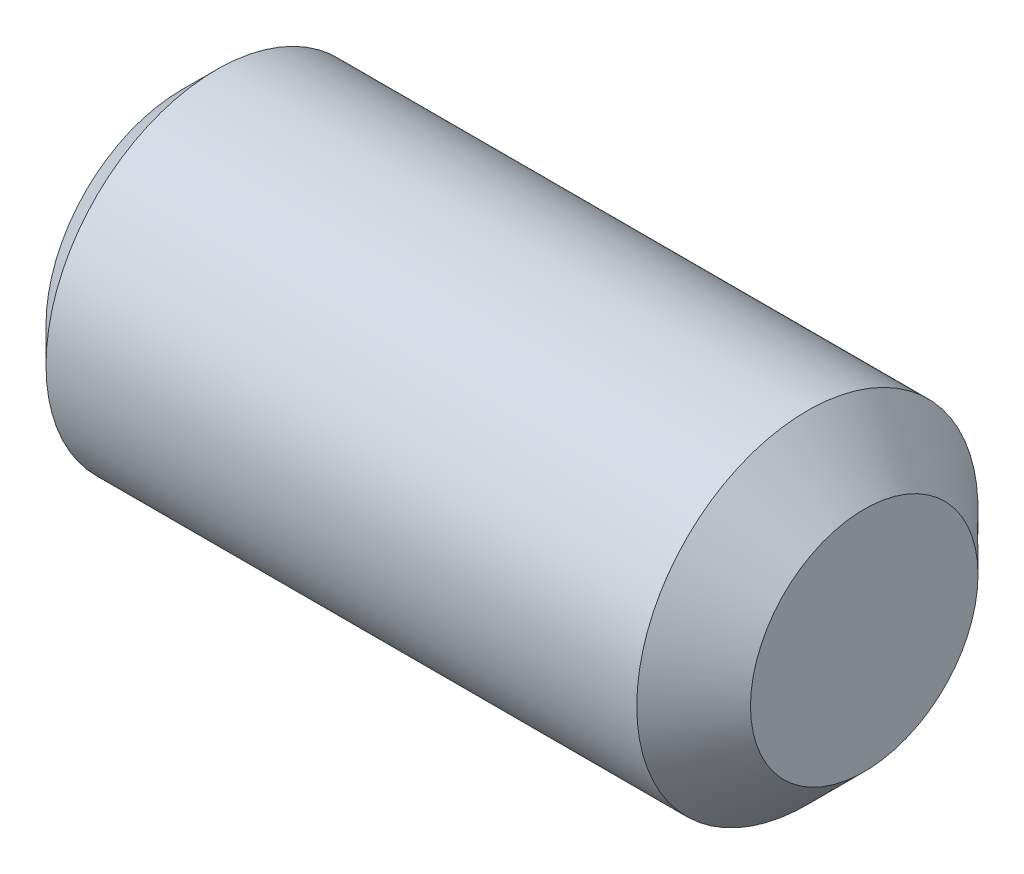
ISO-10303-21;
HEADER;
FILE_DESCRIPTION(('STEP AP214'),'2;1');
FILE_NAME('part.step','',(''),(''),'','','');
FILE_SCHEMA(('AUTOMOTIVE_DESIGN { 1 0 10303 214 1 1 1 1 }'));
ENDSEC;
DATA;
#1=APPLICATION_CONTEXT('core data for automotive mechanical design processes');
#2=APPLICATION_PROTOCOL_DEFINITION('international standard','automotive_design',2000,#1);
#3=PRODUCT_CONTEXT('',#1,'mechanical');
#4=PRODUCT('Part','Part','',(#3));
#5=PRODUCT_RELATED_PRODUCT_CATEGORY('part','',(#4));
#6=PRODUCT_DEFINITION_FORMATION('','',#4);
#7=PRODUCT_DEFINITION_CONTEXT('part definition',#1,'design');
#8=PRODUCT_DEFINITION('design','',#6,#7);
#9=PRODUCT_DEFINITION_SHAPE('','',#8);
#10=(LENGTH_UNIT() NAMED_UNIT(*) SI_UNIT(.MILLI.,.METRE.));
#11=(NAMED_UNIT(*) PLANE_ANGLE_UNIT() SI_UNIT($,.RADIAN.));
#12=(NAMED_UNIT(*) SI_UNIT($,.STERADIAN.) SOLID_ANGLE_UNIT());
#13=UNCERTAINTY_MEASURE_WITH_UNIT(LENGTH_MEASURE(1.E-05),#10,'distance_accuracy_value','');
#14=(GEOMETRIC_REPRESENTATION_CONTEXT(3) GLOBAL_UNCERTAINTY_ASSIGNED_CONTEXT((#13)) GLOBAL_UNIT_ASSIGNED_CONTEXT((#10,
#11,#12)) REPRESENTATION_CONTEXT('',''));
#15=CARTESIAN_POINT('',(0.,0.,0.));
#16=DIRECTION('',(0.,0.,1.));
#17=DIRECTION('',(1.,0.,0.));
#18=AXIS2_PLACEMENT_3D('',#15,#16,#17);
#19=CARTESIAN_POINT('',(0.066987298107776,0.,0.));
#20=DIRECTION('',(-1.,0.,0.));
#21=DIRECTION('',(0.,0.,1.));
#22=AXIS2_PLACEMENT_3D('',#19,#20,#21);
#23=CONICAL_SURFACE('',#22,0.75,1.04719755119663);
#24=CARTESIAN_POINT('',(0.,0.,0.));
#25=DIRECTION('',(-1.,0.,0.));
#26=DIRECTION('',(0.,0.,1.));
#27=AXIS2_PLACEMENT_3D('',#24,#25,#26);
#28=CIRCLE('',#27,0.86602540378444);
#29=CARTESIAN_POINT('',(0.,-0.43301270189222,0.75));
#30=VERTEX_POINT('',#29);
#31=CARTESIAN_POINT('',(0.,0.433012701892219,0.750000000000002));
#32=VERTEX_POINT('',#31);
#33=EDGE_CURVE('E248',#30,#32,#28,.T.);
#34=ORIENTED_EDGE('',*,*,#33,.T.);
#35=CARTESIAN_POINT('',(-0.367419216446796,1.30182498485153,0.75));
#36=CARTESIAN_POINT('',(-0.336286194337809,1.23949069179293,0.75));
#37=CARTESIAN_POINT('',(-0.305518873656635,1.17696369783099,0.75));
#38=CARTESIAN_POINT('',(-0.24523539455497,1.05115584095111,0.75));
#39=CARTESIAN_POINT('',(-0.215721901222432,0.987873705913777,0.75));
#40=CARTESIAN_POINT('',(-0.15731321203445,0.857574414759038,0.75));
#41=CARTESIAN_POINT('',(-0.128505417318115,0.790517217170401,0.75));
#42=CARTESIAN_POINT('',(-0.0742489504864657,0.655115579976257,0.75));
#43=CARTESIAN_POINT('',(-0.0487978367591689,0.586772117798498,0.75));
#44=CARTESIAN_POINT('',(0.00197198044111689,0.431907208204835,0.75));
#45=CARTESIAN_POINT('',(0.0258689195888294,0.344871095166127,0.75));
#46=CARTESIAN_POINT('',(0.0504972553242409,0.212926455004314,0.75));
#47=CARTESIAN_POINT('',(0.0568295189703132,0.169089949911195,0.75));
#48=CARTESIAN_POINT('',(0.0651899032013292,0.081009407289957,0.75));
#49=CARTESIAN_POINT('',(0.0672198544380355,0.0367655511433753,0.75));
#50=CARTESIAN_POINT('',(0.0667103239665797,-0.0519603733569817,0.75));
#51=CARTESIAN_POINT('',(0.0641433675308372,-0.0964422791572119,0.75));
#52=CARTESIAN_POINT('',(0.0547243582415895,-0.184951141964283,0.75));
#53=CARTESIAN_POINT('',(0.0478703012345588,-0.228977876394735,0.75));
#54=CARTESIAN_POINT('',(0.0217562684569865,-0.361463811002233,0.75));
#55=CARTESIAN_POINT('',(-0.00300399861350735,-0.448811292032424,0.75));
#56=CARTESIAN_POINT('',(-0.0544665932767349,-0.602356275667601,0.75));
#57=CARTESIAN_POINT('',(-0.079647543582419,-0.669115866320347,0.75));
#58=CARTESIAN_POINT('',(-0.133130842623687,-0.801426287885035,0.75));
#59=CARTESIAN_POINT('',(-0.161435152579671,-0.86697632880045,0.75));
#60=CARTESIAN_POINT('',(-0.218761891638313,-0.994430125903076,0.75));
#61=CARTESIAN_POINT('',(-0.247703557784464,-1.05637098905487,0.75));
#62=CARTESIAN_POINT('',(-0.306786357064273,-1.17954423903987,0.75));
#63=CARTESIAN_POINT('',(-0.336925257563071,-1.24077769291069,0.75));
#64=CARTESIAN_POINT('',(-0.367419216446796,-1.30182498485153,0.75));
#65=B_SPLINE_CURVE_WITH_KNOTS('',3,(#35,#36,#37,#38,#39,#40,#41,#42,#43,#44,#45,#46,#47,#48,#49,
#50,#51,#52,#53,#54,#55,#56,#57,#58,#59,#60,#61,#62,#63,#64),.UNSPECIFIED.,.F.,.F.,(4,2,2,2,2,2,
2,2,2,2,2,2,2,2,4),(0.,0.209040579945327,0.418505275207292,0.637383908966089,0.856102444312728,
1.12594986290209,1.25864519130386,1.39128404594834,1.5247183021094,1.65821498340068,
1.9296997964465,2.14369893304996,2.35783321698336,2.56292739013515,2.76765556911161),.UNSPECIFIED.);
#66=EDGE_CURVE('E207',#32,#30,#65,.T.);
#67=ORIENTED_EDGE('',*,*,#66,.T.);
#68=EDGE_LOOP('',(#34,#67));
#69=FACE_BOUND('',#68,.T.);
#70=ADVANCED_FACE('F43',(#69),#23,.F.);
#71=CARTESIAN_POINT('',(0.,-0.86602540378444,0.));
#72=VERTEX_POINT('',#71);
#73=EDGE_CURVE('E254',#72,#30,#28,.T.);
#74=ORIENTED_EDGE('',*,*,#73,.T.);
#75=CARTESIAN_POINT('',(-6.66799982216975E-05,-0.432897231838382,0.7502));
#76=CARTESIAN_POINT('',(0.0109279672545937,-0.451927466563575,0.717238666576005));
#77=CARTESIAN_POINT('',(0.0209278588304354,-0.471121965786388,0.68399281869625));
#78=CARTESIAN_POINT('',(0.0383842880739206,-0.509843463020723,0.616925218141245));
#79=CARTESIAN_POINT('',(0.0458346476710116,-0.529371149991444,0.583102272153656));
#80=CARTESIAN_POINT('',(0.0574342962607376,-0.568184468451571,0.515875632570365));
#81=CARTESIAN_POINT('',(0.0616607517951326,-0.587464121753208,0.482482293499617));
#82=CARTESIAN_POINT('',(0.0667098540533253,-0.62611432721818,0.415538173911309));
#83=CARTESIAN_POINT('',(0.0675366780658271,-0.64548473853008,0.381987637355591));
#84=CARTESIAN_POINT('',(0.0658332319602428,-0.681691493033273,0.319275698978887));
#85=CARTESIAN_POINT('',(0.0637212206264558,-0.698533206359486,0.290104995811377));
#86=CARTESIAN_POINT('',(0.0570222121958331,-0.732106888903209,0.231953671848461));
#87=CARTESIAN_POINT('',(0.0524329180465278,-0.748838741655416,0.202973252776877));
#88=CARTESIAN_POINT('',(0.0409580031195634,-0.78248186682648,0.144701650655195));
#89=CARTESIAN_POINT('',(0.0340236523302089,-0.799388872640539,0.115417857581382));
#90=CARTESIAN_POINT('',(0.0182846224056355,-0.832950456252016,0.0572874895838324));
#91=CARTESIAN_POINT('',(0.00948365081374504,-0.849605465334801,0.028440167651929));
#92=CARTESIAN_POINT('',(-6.66799982222013E-05,-0.866140873838278,-0.000199999999999949));
#93=B_SPLINE_CURVE_WITH_KNOTS('',3,(#75,#76,#77,#78,#79,#80,#81,#82,#83,#84,#85,#86,#87,#88,#89,
#90,#91,#92),.UNSPECIFIED.,.F.,.F.,(4,2,2,2,2,2,2,2,4),(0.,0.11889681935934,0.238079744533802,
0.354311719456397,0.47040083187251,0.571553114284101,0.672799351342652,0.776293900714046,
0.879584779344048),.UNSPECIFIED.);
#94=EDGE_CURVE('E146',#30,#72,#93,.T.);
#95=ORIENTED_EDGE('',*,*,#94,.T.);
#96=EDGE_LOOP('',(#74,#95));
#97=FACE_BOUND('',#96,.T.);
#98=ADVANCED_FACE('F225',(#97),#23,.F.);
#99=CARTESIAN_POINT('',(0.,-0.43301270189222,-0.75));
#100=VERTEX_POINT('',#99);
#101=EDGE_CURVE('E256',#100,#72,#28,.T.);
#102=ORIENTED_EDGE('',*,*,#101,.T.);
#103=CARTESIAN_POINT('',(-6.66799982223054E-05,-0.866140873838278,0.000200000000000009));
#104=CARTESIAN_POINT('',(0.0109279672545932,-0.847110639113085,-0.0327613334239954));
#105=CARTESIAN_POINT('',(0.0209278588304349,-0.827916139890272,-0.0660071813037496));
#106=CARTESIAN_POINT('',(0.0383842880739202,-0.789194642655937,-0.133074781858755));
#107=CARTESIAN_POINT('',(0.0458346476710112,-0.769666955685216,-0.166897727846344));
#108=CARTESIAN_POINT('',(0.0574342962607374,-0.730853637225089,-0.234124367429635));
#109=CARTESIAN_POINT('',(0.0616607517951325,-0.711573983923452,-0.267517706500384));
#110=CARTESIAN_POINT('',(0.0667098540533252,-0.67292377845848,-0.334461826088691));
#111=CARTESIAN_POINT('',(0.0675366780658271,-0.65355336714658,-0.36801236264441));
#112=CARTESIAN_POINT('',(0.0658332319602429,-0.617346612643387,-0.430724301021114));
#113=CARTESIAN_POINT('',(0.0637212206264558,-0.600504899317174,-0.459895004188623));
#114=CARTESIAN_POINT('',(0.0570222121958332,-0.566931216773451,-0.51804632815154));
#115=CARTESIAN_POINT('',(0.052432918046528,-0.550199364021244,-0.547026747223123));
#116=CARTESIAN_POINT('',(0.0409580031195637,-0.51655623885018,-0.605298349344806));
#117=CARTESIAN_POINT('',(0.0340236523302093,-0.499649233036121,-0.634582142418618));
#118=CARTESIAN_POINT('',(0.0182846224056359,-0.466087649424644,-0.692712510416168));
#119=CARTESIAN_POINT('',(0.00948365081374549,-0.449432640341859,-0.721559832348071));
#120=CARTESIAN_POINT('',(-6.66799982217076E-05,-0.432897231838382,-0.7502));
#121=B_SPLINE_CURVE_WITH_KNOTS('',3,(#103,#104,#105,#106,#107,#108,#109,#110,#111,#112,#113,
#114,#115,#116,#117,#118,#119,#120),.UNSPECIFIED.,.F.,.F.,(4,2,2,2,2,2,2,2,4),(0.,
0.11889681935934,0.238079744533802,0.354311719456397,0.470400831872511,0.571553114284102,
0.672799351342652,0.776293900714047,0.879584779344048),.UNSPECIFIED.);
#122=EDGE_CURVE('E196',#72,#100,#121,.T.);
#123=ORIENTED_EDGE('',*,*,#122,.T.);
#124=EDGE_LOOP('',(#102,#123));
#125=FACE_BOUND('',#124,.T.);
#126=ADVANCED_FACE('F231',(#125),#23,.F.);
#127=CARTESIAN_POINT('',(0.,0.43301270189222,-0.75));
#128=VERTEX_POINT('',#127);
#129=EDGE_CURVE('E253',#128,#100,#28,.T.);
#130=ORIENTED_EDGE('',*,*,#129,.T.);
#131=CARTESIAN_POINT('',(-0.367419216446796,-1.30182498485153,-0.75));
#132=CARTESIAN_POINT('',(-0.336286194337809,-1.23949069179293,-0.75));
#133=CARTESIAN_POINT('',(-0.305518873656635,-1.17696369783099,-0.75));
#134=CARTESIAN_POINT('',(-0.24523539455497,-1.05115584095111,-0.75));
#135=CARTESIAN_POINT('',(-0.215721901222432,-0.987873705913777,-0.75));
#136=CARTESIAN_POINT('',(-0.15731321203445,-0.857574414759038,-0.75));
#137=CARTESIAN_POINT('',(-0.128505417318115,-0.790517217170401,-0.75));
#138=CARTESIAN_POINT('',(-0.0742489504864657,-0.655115579976257,-0.75));
#139=CARTESIAN_POINT('',(-0.0487978367591689,-0.586772117798498,-0.75));
#140=CARTESIAN_POINT('',(0.00197198044111689,-0.431907208204835,-0.75));
#141=CARTESIAN_POINT('',(0.0258689195888294,-0.344871095166127,-0.75));
#142=CARTESIAN_POINT('',(0.0504972553242409,-0.212926455004314,-0.75));
#143=CARTESIAN_POINT('',(0.0568295189703132,-0.169089949911195,-0.75));
#144=CARTESIAN_POINT('',(0.0651899032013292,-0.081009407289957,-0.75));
#145=CARTESIAN_POINT('',(0.0672198544380355,-0.0367655511433753,-0.75));
#146=CARTESIAN_POINT('',(0.0667103239665797,0.0519603733569817,-0.75));
#147=CARTESIAN_POINT('',(0.0641433675308372,0.0964422791572119,-0.75));
#148=CARTESIAN_POINT('',(0.0547243582415895,0.184951141964283,-0.75));
#149=CARTESIAN_POINT('',(0.0478703012345588,0.228977876394735,-0.75));
#150=CARTESIAN_POINT('',(0.0217562684569865,0.361463811002233,-0.75));
#151=CARTESIAN_POINT('',(-0.00300399861350735,0.448811292032424,-0.75));
#152=CARTESIAN_POINT('',(-0.0544665932767349,0.602356275667601,-0.75));
#153=CARTESIAN_POINT('',(-0.079647543582419,0.669115866320347,-0.75));
#154=CARTESIAN_POINT('',(-0.133130842623687,0.801426287885035,-0.75));
#155=CARTESIAN_POINT('',(-0.161435152579671,0.86697632880045,-0.75));
#156=CARTESIAN_POINT('',(-0.218761891638313,0.994430125903076,-0.75));
#157=CARTESIAN_POINT('',(-0.247703557784464,1.05637098905487,-0.75));
#158=CARTESIAN_POINT('',(-0.306786357064273,1.17954423903987,-0.75));
#159=CARTESIAN_POINT('',(-0.336925257563071,1.24077769291069,-0.75));
#160=CARTESIAN_POINT('',(-0.367419216446796,1.30182498485153,-0.75));
#161=B_SPLINE_CURVE_WITH_KNOTS('',3,(#131,#132,#133,#134,#135,#136,#137,#138,#139,#140,#141,
#142,#143,#144,#145,#146,#147,#148,#149,#150,#151,#152,#153,#154,#155,#156,#157,#158,#159,#160),
.UNSPECIFIED.,.F.,.F.,(4,2,2,2,2,2,2,2,2,2,2,2,2,2,4),(0.,0.209040579945327,0.418505275207292,
0.637383908966089,0.856102444312728,1.12594986290209,1.25864519130386,1.39128404594834,
1.5247183021094,1.65821498340068,1.9296997964465,2.14369893304996,2.35783321698336,
2.56292739013515,2.76765556911161),.UNSPECIFIED.);
#162=EDGE_CURVE('E190',#100,#128,#161,.T.);
#163=ORIENTED_EDGE('',*,*,#162,.T.);
#164=EDGE_LOOP('',(#130,#163));
#165=FACE_BOUND('',#164,.T.);
#166=ADVANCED_FACE('F242',(#165),#23,.F.);
#167=CARTESIAN_POINT('',(0.,0.86602540378444,0.));
#168=VERTEX_POINT('',#167);
#169=EDGE_CURVE('E247',#168,#128,#28,.T.);
#170=ORIENTED_EDGE('',*,*,#169,.T.);
#171=CARTESIAN_POINT('',(-6.66799982216975E-05,0.432897231838382,-0.7502));
#172=CARTESIAN_POINT('',(0.0109279672545937,0.451927466563575,-0.717238666576005));
#173=CARTESIAN_POINT('',(0.0209278588304354,0.471121965786388,-0.68399281869625));
#174=CARTESIAN_POINT('',(0.0383842880739206,0.509843463020723,-0.616925218141245));
#175=CARTESIAN_POINT('',(0.0458346476710116,0.529371149991444,-0.583102272153656));
#176=CARTESIAN_POINT('',(0.0574342962607376,0.568184468451571,-0.515875632570365));
#177=CARTESIAN_POINT('',(0.0616607517951326,0.587464121753208,-0.482482293499617));
#178=CARTESIAN_POINT('',(0.0667098540533253,0.62611432721818,-0.415538173911309));
#179=CARTESIAN_POINT('',(0.0675366780658271,0.64548473853008,-0.381987637355591));
#180=CARTESIAN_POINT('',(0.0658332319602428,0.681691493033273,-0.319275698978887));
#181=CARTESIAN_POINT('',(0.0637212206264558,0.698533206359486,-0.290104995811377));
#182=CARTESIAN_POINT('',(0.0570222121958331,0.732106888903209,-0.231953671848461));
#183=CARTESIAN_POINT('',(0.0524329180465278,0.748838741655416,-0.202973252776877));
#184=CARTESIAN_POINT('',(0.0409580031195634,0.78248186682648,-0.144701650655195));
#185=CARTESIAN_POINT('',(0.0340236523302089,0.799388872640539,-0.115417857581382));
#186=CARTESIAN_POINT('',(0.0182846224056355,0.832950456252016,-0.0572874895838324));
#187=CARTESIAN_POINT('',(0.00948365081374504,0.849605465334801,-0.028440167651929));
#188=CARTESIAN_POINT('',(-6.66799982222013E-05,0.866140873838278,0.000199999999999949));
#189=B_SPLINE_CURVE_WITH_KNOTS('',3,(#171,#172,#173,#174,#175,#176,#177,#178,#179,#180,#181,
#182,#183,#184,#185,#186,#187,#188),.UNSPECIFIED.,.F.,.F.,(4,2,2,2,2,2,2,2,4),(0.,
0.11889681935934,0.238079744533802,0.354311719456397,0.47040083187251,0.571553114284101,
0.672799351342652,0.776293900714046,0.879584779344048),.UNSPECIFIED.);
#190=EDGE_CURVE('E149',#128,#168,#189,.T.);
#191=ORIENTED_EDGE('',*,*,#190,.T.);
#192=EDGE_LOOP('',(#170,#191));
#193=FACE_BOUND('',#192,.T.);
#194=ADVANCED_FACE('F235',(#193),#23,.F.);
#195=EDGE_CURVE('E245',#32,#168,#28,.T.);
#196=ORIENTED_EDGE('',*,*,#195,.T.);
#197=CARTESIAN_POINT('',(-6.66799982223054E-05,0.866140873838278,-0.000200000000000009));
#198=CARTESIAN_POINT('',(0.0109279672545932,0.847110639113085,0.0327613334239954));
#199=CARTESIAN_POINT('',(0.0209278588304349,0.827916139890272,0.0660071813037496));
#200=CARTESIAN_POINT('',(0.0383842880739202,0.789194642655937,0.133074781858755));
#201=CARTESIAN_POINT('',(0.0458346476710112,0.769666955685216,0.166897727846344));
#202=CARTESIAN_POINT('',(0.0574342962607374,0.730853637225089,0.234124367429635));
#203=CARTESIAN_POINT('',(0.0616607517951325,0.711573983923452,0.267517706500384));
#204=CARTESIAN_POINT('',(0.0667098540533252,0.67292377845848,0.334461826088691));
#205=CARTESIAN_POINT('',(0.0675366780658271,0.65355336714658,0.36801236264441));
#206=CARTESIAN_POINT('',(0.0658332319602429,0.617346612643387,0.430724301021114));
#207=CARTESIAN_POINT('',(0.0637212206264558,0.600504899317174,0.459895004188623));
#208=CARTESIAN_POINT('',(0.0570222121958332,0.566931216773451,0.51804632815154));
#209=CARTESIAN_POINT('',(0.052432918046528,0.550199364021244,0.547026747223123));
#210=CARTESIAN_POINT('',(0.0409580031195637,0.51655623885018,0.605298349344806));
#211=CARTESIAN_POINT('',(0.0340236523302093,0.499649233036121,0.634582142418618));
#212=CARTESIAN_POINT('',(0.0182846224056359,0.466087649424644,0.692712510416168));
#213=CARTESIAN_POINT('',(0.00948365081374549,0.449432640341859,0.721559832348071));
#214=CARTESIAN_POINT('',(-6.66799982217076E-05,0.432897231838382,0.7502));
#215=B_SPLINE_CURVE_WITH_KNOTS('',3,(#197,#198,#199,#200,#201,#202,#203,#204,#205,#206,#207,
#208,#209,#210,#211,#212,#213,#214),.UNSPECIFIED.,.F.,.F.,(4,2,2,2,2,2,2,2,4),(0.,
0.11889681935934,0.238079744533802,0.354311719456397,0.470400831872511,0.571553114284102,
0.672799351342652,0.776293900714047,0.879584779344048),.UNSPECIFIED.);
#216=EDGE_CURVE('E57',#168,#32,#215,.T.);
#217=ORIENTED_EDGE('',*,*,#216,.T.);
#218=EDGE_LOOP('',(#196,#217));
#219=FACE_BOUND('',#218,.T.);
#220=ADVANCED_FACE('F227',(#219),#23,.F.);
#221=CARTESIAN_POINT('',(0.,0.,0.));
#222=DIRECTION('',(1.,0.,0.));
#223=DIRECTION('',(0.,0.,-1.));
#224=AXIS2_PLACEMENT_3D('',#221,#222,#223);
#225=PLANE('',#224);
#226=ORIENTED_EDGE('',*,*,#195,.F.);
#227=ORIENTED_EDGE('',*,*,#33,.F.);
#228=ORIENTED_EDGE('',*,*,#73,.F.);
#229=ORIENTED_EDGE('',*,*,#101,.F.);
#230=ORIENTED_EDGE('',*,*,#129,.F.);
#231=ORIENTED_EDGE('',*,*,#169,.F.);
#232=EDGE_LOOP('',(#226,#227,#228,#229,#230,#231));
#233=FACE_BOUND('',#232,.T.);
#234=CARTESIAN_POINT('',(0.,0.,0.));
#235=DIRECTION('',(-1.,0.,0.));
#236=DIRECTION('',(0.,0.,1.));
#237=AXIS2_PLACEMENT_3D('',#234,#235,#236);
#238=CIRCLE('',#237,1.1935);
#239=CARTESIAN_POINT('',(0.,0.,1.1935));
#240=VERTEX_POINT('',#239);
#241=EDGE_CURVE('E11',#240,#240,#238,.T.);
#242=ORIENTED_EDGE('',*,*,#241,.T.);
#243=EDGE_LOOP('',(#242));
#244=FACE_BOUND('',#243,.T.);
#245=ADVANCED_FACE('F45',(#233,#244),#225,.F.);
#246=CARTESIAN_POINT('',(0.3065,0.,0.));
#247=DIRECTION('',(1.,0.,0.));
#248=DIRECTION('',(0.,0.,-1.));
#249=AXIS2_PLACEMENT_3D('',#246,#247,#248);
#250=CONICAL_SURFACE('',#249,1.5,0.785398163397448);
#251=ORIENTED_EDGE('',*,*,#241,.F.);
#252=EDGE_LOOP('',(#251));
#253=FACE_BOUND('',#252,.T.);
#254=CARTESIAN_POINT('',(0.3065,0.,0.));
#255=DIRECTION('',(-1.,0.,0.));
#256=DIRECTION('',(0.,0.,1.));
#257=AXIS2_PLACEMENT_3D('',#254,#255,#256);
#258=CIRCLE('',#257,1.5);
#259=CARTESIAN_POINT('',(0.3065,0.,1.5));
#260=VERTEX_POINT('',#259);
#261=EDGE_CURVE('E51',#260,#260,#258,.T.);
#262=ORIENTED_EDGE('',*,*,#261,.T.);
#263=EDGE_LOOP('',(#262));
#264=FACE_BOUND('',#263,.T.);
#265=ADVANCED_FACE('F240',(#253,#264),#250,.T.);
#266=CARTESIAN_POINT('',(6.,0.,0.));
#267=DIRECTION('',(-1.,0.,0.));
#268=DIRECTION('',(0.,0.,1.));
#269=AXIS2_PLACEMENT_3D('',#266,#267,#268);
#270=CYLINDRICAL_SURFACE('',#269,1.5);
#271=ORIENTED_EDGE('',*,*,#261,.F.);
#272=EDGE_LOOP('',(#271));
#273=FACE_BOUND('',#272,.T.);
#274=CARTESIAN_POINT('',(5.5,0.,0.));
#275=DIRECTION('',(-1.,0.,0.));
#276=DIRECTION('',(0.,0.,1.));
#277=AXIS2_PLACEMENT_3D('',#274,#275,#276);
#278=CIRCLE('',#277,1.5);
#279=CARTESIAN_POINT('',(5.5,0.,1.5));
#280=VERTEX_POINT('',#279);
#281=EDGE_CURVE('E317',#280,#280,#278,.T.);
#282=ORIENTED_EDGE('',*,*,#281,.T.);
#283=EDGE_LOOP('',(#282));
#284=FACE_BOUND('',#283,.T.);
#285=ADVANCED_FACE('F323',(#273,#284),#270,.T.);
#286=CARTESIAN_POINT('',(6.,0.,0.));
#287=DIRECTION('',(-1.,0.,0.));
#288=DIRECTION('',(0.,0.,1.));
#289=AXIS2_PLACEMENT_3D('',#286,#287,#288);
#290=CONICAL_SURFACE('',#289,1.,0.785398163397448);
#291=ORIENTED_EDGE('',*,*,#281,.F.);
#292=EDGE_LOOP('',(#291));
#293=FACE_BOUND('',#292,.T.);
#294=CARTESIAN_POINT('',(6.,0.,0.));
#295=DIRECTION('',(-1.,0.,0.));
#296=DIRECTION('',(0.,0.,1.));
#297=AXIS2_PLACEMENT_3D('',#294,#295,#296);
#298=CIRCLE('',#297,1.);
#299=CARTESIAN_POINT('',(6.,0.,1.));
#300=VERTEX_POINT('',#299);
#301=EDGE_CURVE('E312',#300,#300,#298,.T.);
#302=ORIENTED_EDGE('',*,*,#301,.T.);
#303=EDGE_LOOP('',(#302));
#304=FACE_BOUND('',#303,.T.);
#305=ADVANCED_FACE('F221',(#293,#304),#290,.T.);
#306=CARTESIAN_POINT('',(6.,1.,0.));
#307=DIRECTION('',(-1.,0.,0.));
#308=DIRECTION('',(0.,0.,1.));
#309=AXIS2_PLACEMENT_3D('',#306,#307,#308);
#310=PLANE('',#309);
#311=ORIENTED_EDGE('',*,*,#301,.F.);
#312=EDGE_LOOP('',(#311));
#313=FACE_BOUND('',#312,.T.);
#314=ADVANCED_FACE('F217',(#313),#310,.F.);
#315=CARTESIAN_POINT('',(2.,0.43301270189222,0.75));
#316=DIRECTION('',(0.,0.,-1.));
#317=DIRECTION('',(-1.,0.,0.));
#318=AXIS2_PLACEMENT_3D('',#315,#316,#317);
#319=PLANE('',#318);
#320=DIRECTION('',(-1.,0.,0.));
#321=VECTOR('',#320,1.);
#322=CARTESIAN_POINT('',(2.,0.43301270189222,0.75));
#323=LINE('',#322,#321);
#324=CARTESIAN_POINT('',(2.,0.43301270189222,0.75));
#325=VERTEX_POINT('',#324);
#326=EDGE_CURVE('E257',#325,#32,#323,.T.);
#327=ORIENTED_EDGE('',*,*,#326,.F.);
#328=DIRECTION('',(0.,-1.,0.));
#329=VECTOR('',#328,1.);
#330=CARTESIAN_POINT('',(2.,0.43301270189222,0.75));
#331=LINE('',#330,#329);
#332=CARTESIAN_POINT('',(2.,0.,0.75));
#333=VERTEX_POINT('',#332);
#334=EDGE_CURVE('E129',#325,#333,#331,.T.);
#335=ORIENTED_EDGE('',*,*,#334,.T.);
#336=CARTESIAN_POINT('',(2.,-0.43301270189222,0.75));
#337=VERTEX_POINT('',#336);
#338=EDGE_CURVE('E120',#333,#337,#331,.T.);
#339=ORIENTED_EDGE('',*,*,#338,.T.);
#340=DIRECTION('',(-1.,0.,0.));
#341=VECTOR('',#340,1.);
#342=CARTESIAN_POINT('',(2.,-0.43301270189222,0.75));
#343=LINE('',#342,#341);
#344=EDGE_CURVE('E126',#337,#30,#343,.T.);
#345=ORIENTED_EDGE('',*,*,#344,.T.);
#346=ORIENTED_EDGE('',*,*,#66,.F.);
#347=EDGE_LOOP('',(#327,#335,#339,#345,#346));
#348=FACE_BOUND('',#347,.T.);
#349=ADVANCED_FACE('F123',(#348),#319,.T.);
#350=CARTESIAN_POINT('',(2.,-0.43301270189222,0.75));
#351=DIRECTION('',(0.,0.866025403784438,-0.500000000000001));
#352=DIRECTION('',(0.,0.500000000000001,0.866025403784438));
#353=AXIS2_PLACEMENT_3D('',#350,#351,#352);
#354=PLANE('',#353);
#355=ORIENTED_EDGE('',*,*,#344,.F.);
#356=DIRECTION('',(0.,-0.500000000000001,-0.866025403784438));
#357=VECTOR('',#356,1.);
#358=CARTESIAN_POINT('',(2.,-0.43301270189222,0.75));
#359=LINE('',#358,#357);
#360=CARTESIAN_POINT('',(2.,-0.64951905283833,0.375000000000001));
#361=VERTEX_POINT('',#360);
#362=EDGE_CURVE('E134',#337,#361,#359,.T.);
#363=ORIENTED_EDGE('',*,*,#362,.T.);
#364=CARTESIAN_POINT('',(2.,-0.86602540378444,0.));
#365=VERTEX_POINT('',#364);
#366=EDGE_CURVE('E141',#361,#365,#359,.T.);
#367=ORIENTED_EDGE('',*,*,#366,.T.);
#368=DIRECTION('',(-1.,0.,0.));
#369=VECTOR('',#368,1.);
#370=CARTESIAN_POINT('',(2.,-0.86602540378444,0.));
#371=LINE('',#370,#369);
#372=EDGE_CURVE('E147',#365,#72,#371,.T.);
#373=ORIENTED_EDGE('',*,*,#372,.T.);
#374=ORIENTED_EDGE('',*,*,#94,.F.);
#375=EDGE_LOOP('',(#355,#363,#367,#373,#374));
#376=FACE_BOUND('',#375,.T.);
#377=ADVANCED_FACE('F144',(#376),#354,.T.);
#378=CARTESIAN_POINT('',(2.,-0.86602540378444,0.));
#379=DIRECTION('',(0.,0.866025403784438,0.500000000000001));
#380=DIRECTION('',(0.,-0.500000000000001,0.866025403784438));
#381=AXIS2_PLACEMENT_3D('',#378,#379,#380);
#382=PLANE('',#381);
#383=ORIENTED_EDGE('',*,*,#372,.F.);
#384=DIRECTION('',(0.,0.500000000000001,-0.866025403784438));
#385=VECTOR('',#384,1.);
#386=CARTESIAN_POINT('',(2.,-0.86602540378444,0.));
#387=LINE('',#386,#385);
#388=CARTESIAN_POINT('',(2.,-0.649519052838329,-0.375));
#389=VERTEX_POINT('',#388);
#390=EDGE_CURVE('E65',#365,#389,#387,.T.);
#391=ORIENTED_EDGE('',*,*,#390,.T.);
#392=CARTESIAN_POINT('',(2.,-0.43301270189222,-0.75));
#393=VERTEX_POINT('',#392);
#394=EDGE_CURVE('E140',#389,#393,#387,.T.);
#395=ORIENTED_EDGE('',*,*,#394,.T.);
#396=DIRECTION('',(-1.,0.,0.));
#397=VECTOR('',#396,1.);
#398=CARTESIAN_POINT('',(2.,-0.43301270189222,-0.75));
#399=LINE('',#398,#397);
#400=EDGE_CURVE('E151',#393,#100,#399,.T.);
#401=ORIENTED_EDGE('',*,*,#400,.T.);
#402=ORIENTED_EDGE('',*,*,#122,.F.);
#403=EDGE_LOOP('',(#383,#391,#395,#401,#402));
#404=FACE_BOUND('',#403,.T.);
#405=ADVANCED_FACE('F186',(#404),#382,.T.);
#406=CARTESIAN_POINT('',(2.,-0.43301270189222,-0.75));
#407=DIRECTION('',(0.,0.,1.));
#408=DIRECTION('',(1.,0.,0.));
#409=AXIS2_PLACEMENT_3D('',#406,#407,#408);
#410=PLANE('',#409);
#411=ORIENTED_EDGE('',*,*,#400,.F.);
#412=DIRECTION('',(0.,1.,0.));
#413=VECTOR('',#412,1.);
#414=CARTESIAN_POINT('',(2.,-0.43301270189222,-0.75));
#415=LINE('',#414,#413);
#416=CARTESIAN_POINT('',(2.,0.,-0.75));
#417=VERTEX_POINT('',#416);
#418=EDGE_CURVE('E270',#393,#417,#415,.T.);
#419=ORIENTED_EDGE('',*,*,#418,.T.);
#420=CARTESIAN_POINT('',(2.,0.43301270189222,-0.75));
#421=VERTEX_POINT('',#420);
#422=EDGE_CURVE('E269',#417,#421,#415,.T.);
#423=ORIENTED_EDGE('',*,*,#422,.T.);
#424=DIRECTION('',(-1.,0.,0.));
#425=VECTOR('',#424,1.);
#426=CARTESIAN_POINT('',(2.,0.43301270189222,-0.75));
#427=LINE('',#426,#425);
#428=EDGE_CURVE('E280',#421,#128,#427,.T.);
#429=ORIENTED_EDGE('',*,*,#428,.T.);
#430=ORIENTED_EDGE('',*,*,#162,.F.);
#431=EDGE_LOOP('',(#411,#419,#423,#429,#430));
#432=FACE_BOUND('',#431,.T.);
#433=ADVANCED_FACE('F181',(#432),#410,.T.);
#434=CARTESIAN_POINT('',(2.,0.43301270189222,-0.75));
#435=DIRECTION('',(0.,-0.866025403784438,0.500000000000001));
#436=DIRECTION('',(0.,-0.500000000000001,-0.866025403784438));
#437=AXIS2_PLACEMENT_3D('',#434,#435,#436);
#438=PLANE('',#437);
#439=ORIENTED_EDGE('',*,*,#428,.F.);
#440=DIRECTION('',(0.,0.500000000000001,0.866025403784438));
#441=VECTOR('',#440,1.);
#442=CARTESIAN_POINT('',(2.,0.43301270189222,-0.75));
#443=LINE('',#442,#441);
#444=CARTESIAN_POINT('',(2.,0.64951905283833,-0.375000000000001));
#445=VERTEX_POINT('',#444);
#446=EDGE_CURVE('E274',#421,#445,#443,.T.);
#447=ORIENTED_EDGE('',*,*,#446,.T.);
#448=CARTESIAN_POINT('',(2.,0.86602540378444,0.));
#449=VERTEX_POINT('',#448);
#450=EDGE_CURVE('E273',#445,#449,#443,.T.);
#451=ORIENTED_EDGE('',*,*,#450,.T.);
#452=DIRECTION('',(-1.,0.,0.));
#453=VECTOR('',#452,1.);
#454=CARTESIAN_POINT('',(2.,0.86602540378444,0.));
#455=LINE('',#454,#453);
#456=EDGE_CURVE('E258',#449,#168,#455,.T.);
#457=ORIENTED_EDGE('',*,*,#456,.T.);
#458=ORIENTED_EDGE('',*,*,#190,.F.);
#459=EDGE_LOOP('',(#439,#447,#451,#457,#458));
#460=FACE_BOUND('',#459,.T.);
#461=ADVANCED_FACE('F175',(#460),#438,.T.);
#462=CARTESIAN_POINT('',(2.,0.86602540378444,0.));
#463=DIRECTION('',(0.,-0.866025403784438,-0.500000000000001));
#464=DIRECTION('',(0.,0.500000000000001,-0.866025403784438));
#465=AXIS2_PLACEMENT_3D('',#462,#463,#464);
#466=PLANE('',#465);
#467=ORIENTED_EDGE('',*,*,#456,.F.);
#468=DIRECTION('',(0.,-0.500000000000001,0.866025403784438));
#469=VECTOR('',#468,1.);
#470=CARTESIAN_POINT('',(2.,0.86602540378444,0.));
#471=LINE('',#470,#469);
#472=CARTESIAN_POINT('',(2.,0.64951905283833,0.375000000000001));
#473=VERTEX_POINT('',#472);
#474=EDGE_CURVE('E259',#449,#473,#471,.T.);
#475=ORIENTED_EDGE('',*,*,#474,.T.);
#476=EDGE_CURVE('E264',#473,#325,#471,.T.);
#477=ORIENTED_EDGE('',*,*,#476,.T.);
#478=ORIENTED_EDGE('',*,*,#326,.T.);
#479=ORIENTED_EDGE('',*,*,#216,.F.);
#480=EDGE_LOOP('',(#467,#475,#477,#478,#479));
#481=FACE_BOUND('',#480,.T.);
#482=ADVANCED_FACE('F170',(#481),#466,.T.);
#483=CARTESIAN_POINT('',(2.,0.,0.));
#484=DIRECTION('',(1.,0.,0.));
#485=DIRECTION('',(0.,0.,-1.));
#486=AXIS2_PLACEMENT_3D('',#483,#484,#485);
#487=PLANE('',#486);
#488=CARTESIAN_POINT('',(2.,0.,0.));
#489=DIRECTION('',(-1.,0.,0.));
#490=DIRECTION('',(0.,0.,1.));
#491=AXIS2_PLACEMENT_3D('',#488,#489,#490);
#492=CIRCLE('',#491,0.75);
#493=EDGE_CURVE('E302',#445,#417,#492,.T.);
#494=ORIENTED_EDGE('',*,*,#493,.F.);
#495=ORIENTED_EDGE('',*,*,#446,.F.);
#496=ORIENTED_EDGE('',*,*,#422,.F.);
#497=EDGE_LOOP('',(#494,#495,#496));
#498=FACE_BOUND('',#497,.T.);
#499=ADVANCED_FACE('F174',(#498),#487,.F.);
#500=EDGE_CURVE('E306',#473,#445,#492,.T.);
#501=ORIENTED_EDGE('',*,*,#500,.F.);
#502=ORIENTED_EDGE('',*,*,#474,.F.);
#503=ORIENTED_EDGE('',*,*,#450,.F.);
#504=EDGE_LOOP('',(#501,#502,#503));
#505=FACE_BOUND('',#504,.T.);
#506=ADVANCED_FACE('F478',(#505),#487,.F.);
#507=EDGE_CURVE('E251',#333,#473,#492,.T.);
#508=ORIENTED_EDGE('',*,*,#507,.F.);
#509=ORIENTED_EDGE('',*,*,#334,.F.);
#510=ORIENTED_EDGE('',*,*,#476,.F.);
#511=EDGE_LOOP('',(#508,#509,#510));
#512=FACE_BOUND('',#511,.T.);
#513=ADVANCED_FACE('F263',(#512),#487,.F.);
#514=EDGE_CURVE('E136',#361,#333,#492,.T.);
#515=ORIENTED_EDGE('',*,*,#514,.F.);
#516=ORIENTED_EDGE('',*,*,#362,.F.);
#517=ORIENTED_EDGE('',*,*,#338,.F.);
#518=EDGE_LOOP('',(#515,#516,#517));
#519=FACE_BOUND('',#518,.T.);
#520=ADVANCED_FACE('F135',(#519),#487,.F.);
#521=EDGE_CURVE('E249',#389,#361,#492,.T.);
#522=ORIENTED_EDGE('',*,*,#521,.F.);
#523=ORIENTED_EDGE('',*,*,#390,.F.);
#524=ORIENTED_EDGE('',*,*,#366,.F.);
#525=EDGE_LOOP('',(#522,#523,#524));
#526=FACE_BOUND('',#525,.T.);
#527=ADVANCED_FACE('F501',(#526),#487,.F.);
#528=EDGE_CURVE('E313',#417,#389,#492,.T.);
#529=ORIENTED_EDGE('',*,*,#528,.F.);
#530=ORIENTED_EDGE('',*,*,#418,.F.);
#531=ORIENTED_EDGE('',*,*,#394,.F.);
#532=EDGE_LOOP('',(#529,#530,#531));
#533=FACE_BOUND('',#532,.T.);
#534=ADVANCED_FACE('F177',(#533),#487,.F.);
#535=CARTESIAN_POINT('',(2.4330127018922,0.,0.));
#536=DIRECTION('',(-1.,0.,0.));
#537=DIRECTION('',(0.,0.,1.));
#538=AXIS2_PLACEMENT_3D('',#535,#536,#537);
#539=CONICAL_SURFACE('',#538,0.,1.04719755119662);
#540=ORIENTED_EDGE('',*,*,#507,.T.);
#541=ORIENTED_EDGE('',*,*,#500,.T.);
#542=ORIENTED_EDGE('',*,*,#493,.T.);
#543=ORIENTED_EDGE('',*,*,#528,.T.);
#544=ORIENTED_EDGE('',*,*,#521,.T.);
#545=ORIENTED_EDGE('',*,*,#514,.T.);
#546=EDGE_LOOP('',(#540,#541,#542,#543,#544,#545));
#547=FACE_BOUND('',#546,.T.);
#548=CARTESIAN_POINT('',(2.4330127018922,0.,0.));
#549=VERTEX_POINT('',#548);
#550=VERTEX_LOOP('',#549);
#551=FACE_BOUND('',#550,.T.);
#552=ADVANCED_FACE('F307',(#547,#551),#539,.F.);
#553=CLOSED_SHELL('',(#70,#98,#126,#166,#194,#220,#245,#265,#285,#305,#314,#349,#377,#405,#433,
#461,#482,#499,#506,#513,#520,#527,#534,#552));
#554=MANIFOLD_SOLID_BREP('B2',#553);
#555=ADVANCED_BREP_SHAPE_REPRESENTATION('',(#18,#554),#14);
#556=SHAPE_DEFINITION_REPRESENTATION(#9,#555);
ENDSEC;
END-ISO-10303-21;
